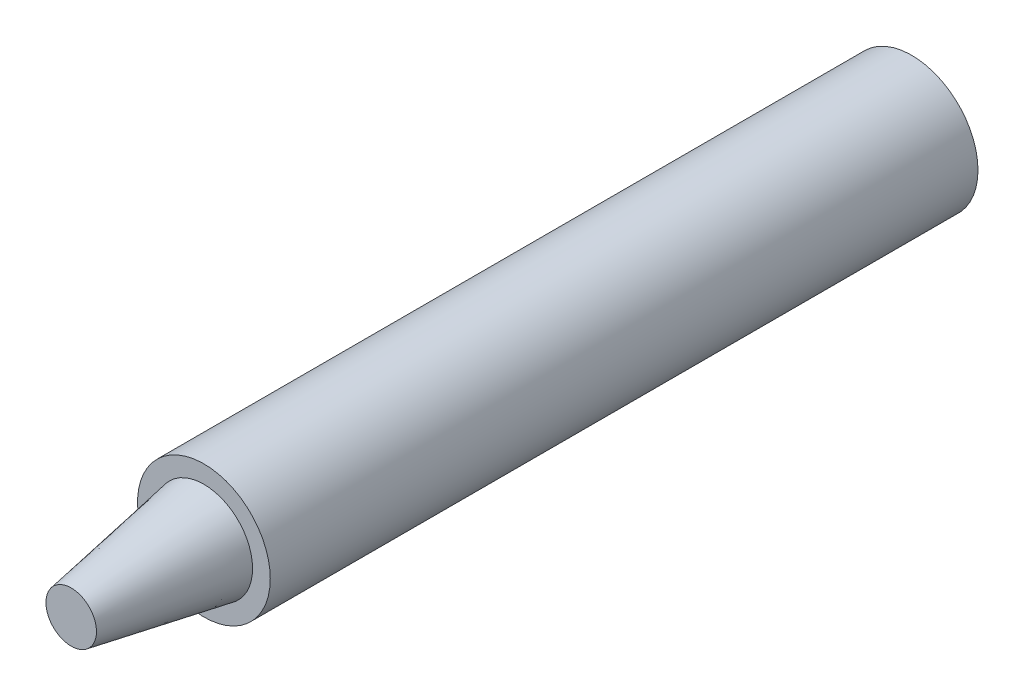
ISO-10303-21;
HEADER;
FILE_DESCRIPTION(('STEP AP214'),'2;1');
FILE_NAME('part.step','',(''),(''),'','','');
FILE_SCHEMA(('AUTOMOTIVE_DESIGN { 1 0 10303 214 1 1 1 1 }'));
ENDSEC;
DATA;
#1=APPLICATION_CONTEXT('core data for automotive mechanical design processes');
#2=APPLICATION_PROTOCOL_DEFINITION('international standard','automotive_design',2000,#1);
#3=PRODUCT_CONTEXT('',#1,'mechanical');
#4=PRODUCT('Part','Part','',(#3));
#5=PRODUCT_RELATED_PRODUCT_CATEGORY('part','',(#4));
#6=PRODUCT_DEFINITION_FORMATION('','',#4);
#7=PRODUCT_DEFINITION_CONTEXT('part definition',#1,'design');
#8=PRODUCT_DEFINITION('design','',#6,#7);
#9=PRODUCT_DEFINITION_SHAPE('','',#8);
#10=(LENGTH_UNIT() NAMED_UNIT(*) SI_UNIT(.MILLI.,.METRE.));
#11=(NAMED_UNIT(*) PLANE_ANGLE_UNIT() SI_UNIT($,.RADIAN.));
#12=(NAMED_UNIT(*) SI_UNIT($,.STERADIAN.) SOLID_ANGLE_UNIT());
#13=UNCERTAINTY_MEASURE_WITH_UNIT(LENGTH_MEASURE(1.E-05),#10,'distance_accuracy_value','');
#14=(GEOMETRIC_REPRESENTATION_CONTEXT(3) GLOBAL_UNCERTAINTY_ASSIGNED_CONTEXT((#13)) GLOBAL_UNIT_ASSIGNED_CONTEXT((#10,
#11,#12)) REPRESENTATION_CONTEXT('',''));
#15=CARTESIAN_POINT('',(0.,0.,0.));
#16=DIRECTION('',(0.,0.,1.));
#17=DIRECTION('',(1.,0.,0.));
#18=AXIS2_PLACEMENT_3D('',#15,#16,#17);
#19=CARTESIAN_POINT('',(0.,0.,101.6));
#20=DIRECTION('',(0.,0.,-1.));
#21=DIRECTION('',(-1.,0.,0.));
#22=AXIS2_PLACEMENT_3D('',#19,#20,#21);
#23=CYLINDRICAL_SURFACE('',#22,9.525);
#24=CARTESIAN_POINT('',(0.,0.,101.6));
#25=DIRECTION('',(0.,0.,1.));
#26=DIRECTION('',(1.,0.,0.));
#27=AXIS2_PLACEMENT_3D('',#24,#25,#26);
#28=CIRCLE('',#27,9.525);
#29=CARTESIAN_POINT('',(9.525,0.,101.6));
#30=VERTEX_POINT('',#29);
#31=EDGE_CURVE('E10',#30,#30,#28,.T.);
#32=ORIENTED_EDGE('',*,*,#31,.F.);
#33=EDGE_LOOP('',(#32));
#34=FACE_BOUND('',#33,.T.);
#35=CARTESIAN_POINT('',(0.,0.,0.));
#36=DIRECTION('',(0.,0.,1.));
#37=DIRECTION('',(1.,0.,0.));
#38=AXIS2_PLACEMENT_3D('',#35,#36,#37);
#39=CIRCLE('',#38,9.525);
#40=CARTESIAN_POINT('',(9.525,0.,0.));
#41=VERTEX_POINT('',#40);
#42=EDGE_CURVE('E40',#41,#41,#39,.T.);
#43=ORIENTED_EDGE('',*,*,#42,.T.);
#44=EDGE_LOOP('',(#43));
#45=FACE_BOUND('',#44,.T.);
#46=ADVANCED_FACE('F37',(#34,#45),#23,.T.);
#47=CARTESIAN_POINT('',(0.,0.,101.6));
#48=DIRECTION('',(0.,0.,1.));
#49=DIRECTION('',(1.,0.,0.));
#50=AXIS2_PLACEMENT_3D('',#47,#48,#49);
#51=PLANE('',#50);
#52=CARTESIAN_POINT('',(0.,0.,101.6));
#53=DIRECTION('',(0.,0.,1.));
#54=DIRECTION('',(1.,0.,0.));
#55=AXIS2_PLACEMENT_3D('',#52,#53,#54);
#56=CIRCLE('',#55,6.985);
#57=CARTESIAN_POINT('',(6.985,0.,101.6));
#58=VERTEX_POINT('',#57);
#59=EDGE_CURVE('E51',#58,#58,#56,.T.);
#60=ORIENTED_EDGE('',*,*,#59,.F.);
#61=EDGE_LOOP('',(#60));
#62=FACE_BOUND('',#61,.T.);
#63=ORIENTED_EDGE('',*,*,#31,.T.);
#64=EDGE_LOOP('',(#63));
#65=FACE_BOUND('',#64,.T.);
#66=ADVANCED_FACE('F57',(#62,#65),#51,.T.);
#67=CARTESIAN_POINT('',(0.,0.,0.));
#68=DIRECTION('',(0.,0.,1.));
#69=DIRECTION('',(1.,0.,0.));
#70=AXIS2_PLACEMENT_3D('',#67,#68,#69);
#71=PLANE('',#70);
#72=ORIENTED_EDGE('',*,*,#42,.F.);
#73=EDGE_LOOP('',(#72));
#74=FACE_BOUND('',#73,.T.);
#75=ADVANCED_FACE('F59',(#74),#71,.F.);
#76=CARTESIAN_POINT('',(0.,0.,101.6));
#77=DIRECTION('',(0.,0.,-1.));
#78=DIRECTION('',(1.,0.,0.));
#79=AXIS2_PLACEMENT_3D('',#76,#77,#78);
#80=CONICAL_SURFACE('',#79,6.985,0.174532925199433);
#81=CARTESIAN_POINT('',(0.,0.,120.65));
#82=DIRECTION('',(0.,0.,1.));
#83=DIRECTION('',(1.,0.,0.));
#84=AXIS2_PLACEMENT_3D('',#81,#82,#83);
#85=CIRCLE('',#84,3.62597101750374);
#86=CARTESIAN_POINT('',(3.62597101750374,0.,120.65));
#87=VERTEX_POINT('',#86);
#88=EDGE_CURVE('E47',#87,#87,#85,.T.);
#89=ORIENTED_EDGE('',*,*,#88,.F.);
#90=EDGE_LOOP('',(#89));
#91=FACE_BOUND('',#90,.T.);
#92=ORIENTED_EDGE('',*,*,#59,.T.);
#93=EDGE_LOOP('',(#92));
#94=FACE_BOUND('',#93,.T.);
#95=ADVANCED_FACE('F55',(#91,#94),#80,.T.);
#96=CARTESIAN_POINT('',(0.,0.,120.65));
#97=DIRECTION('',(0.,0.,1.));
#98=DIRECTION('',(1.,0.,0.));
#99=AXIS2_PLACEMENT_3D('',#96,#97,#98);
#100=PLANE('',#99);
#101=ORIENTED_EDGE('',*,*,#88,.T.);
#102=EDGE_LOOP('',(#101));
#103=FACE_BOUND('',#102,.T.);
#104=ADVANCED_FACE('F70',(#103),#100,.T.);
#105=CLOSED_SHELL('',(#46,#66,#75,#95,#104));
#106=MANIFOLD_SOLID_BREP('B2',#105);
#107=ADVANCED_BREP_SHAPE_REPRESENTATION('',(#18,#106),#14);
#108=SHAPE_DEFINITION_REPRESENTATION(#9,#107);
ENDSEC;
END-ISO-10303-21;
